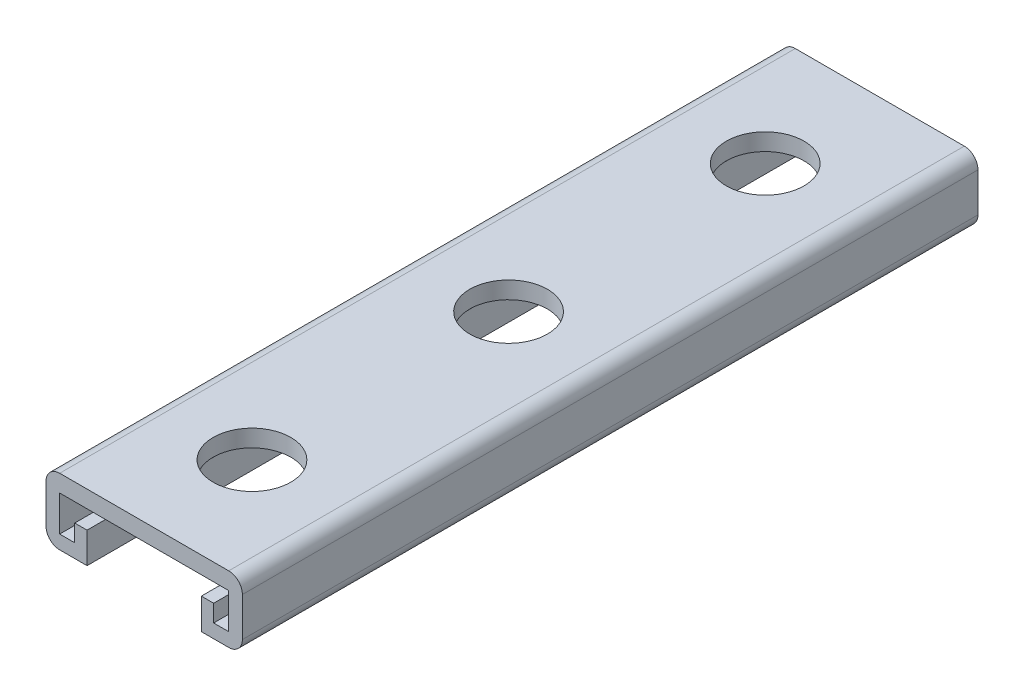
ISO-10303-21;
HEADER;
FILE_DESCRIPTION(('STEP AP214'),'2;1');
FILE_NAME('part.step','',(''),(''),'','','');
FILE_SCHEMA(('AUTOMOTIVE_DESIGN { 1 0 10303 214 1 1 1 1 }'));
ENDSEC;
DATA;
#1=APPLICATION_CONTEXT('core data for automotive mechanical design processes');
#2=APPLICATION_PROTOCOL_DEFINITION('international standard','automotive_design',2000,#1);
#3=PRODUCT_CONTEXT('',#1,'mechanical');
#4=PRODUCT('Part','Part','',(#3));
#5=PRODUCT_RELATED_PRODUCT_CATEGORY('part','',(#4));
#6=PRODUCT_DEFINITION_FORMATION('','',#4);
#7=PRODUCT_DEFINITION_CONTEXT('part definition',#1,'design');
#8=PRODUCT_DEFINITION('design','',#6,#7);
#9=PRODUCT_DEFINITION_SHAPE('','',#8);
#10=(LENGTH_UNIT() NAMED_UNIT(*) SI_UNIT(.MILLI.,.METRE.));
#11=(NAMED_UNIT(*) PLANE_ANGLE_UNIT() SI_UNIT($,.RADIAN.));
#12=(NAMED_UNIT(*) SI_UNIT($,.STERADIAN.) SOLID_ANGLE_UNIT());
#13=UNCERTAINTY_MEASURE_WITH_UNIT(LENGTH_MEASURE(1.E-05),#10,'distance_accuracy_value','');
#14=(GEOMETRIC_REPRESENTATION_CONTEXT(3) GLOBAL_UNCERTAINTY_ASSIGNED_CONTEXT((#13)) GLOBAL_UNIT_ASSIGNED_CONTEXT((#10,
#11,#12)) REPRESENTATION_CONTEXT('',''));
#15=CARTESIAN_POINT('',(0.,0.,0.));
#16=DIRECTION('',(0.,0.,1.));
#17=DIRECTION('',(1.,0.,0.));
#18=AXIS2_PLACEMENT_3D('',#15,#16,#17);
#19=CARTESIAN_POINT('',(0.,0.2,213.));
#20=DIRECTION('',(0.,1.,0.));
#21=DIRECTION('',(0.,0.,1.));
#22=AXIS2_PLACEMENT_3D('',#19,#20,#21);
#23=PLANE('',#22);
#24=CARTESIAN_POINT('',(0.,0.199999999999999,31.5));
#25=DIRECTION('',(0.,1.,0.));
#26=DIRECTION('',(0.,0.,1.));
#27=AXIS2_PLACEMENT_3D('',#24,#25,#26);
#28=CIRCLE('',#27,11.35);
#29=CARTESIAN_POINT('',(0.,0.199999999999999,42.85));
#30=VERTEX_POINT('',#29);
#31=EDGE_CURVE('E195',#30,#30,#28,.T.);
#32=ORIENTED_EDGE('',*,*,#31,.T.);
#33=EDGE_LOOP('',(#32));
#34=FACE_BOUND('',#33,.T.);
#35=CARTESIAN_POINT('',(0.,0.199999999999999,106.5));
#36=DIRECTION('',(0.,1.,0.));
#37=DIRECTION('',(0.,0.,1.));
#38=AXIS2_PLACEMENT_3D('',#35,#36,#37);
#39=CIRCLE('',#38,11.35);
#40=CARTESIAN_POINT('',(0.,0.199999999999999,117.85));
#41=VERTEX_POINT('',#40);
#42=EDGE_CURVE('E525',#41,#41,#39,.T.);
#43=ORIENTED_EDGE('',*,*,#42,.T.);
#44=EDGE_LOOP('',(#43));
#45=FACE_BOUND('',#44,.T.);
#46=CARTESIAN_POINT('',(0.,0.199999999999999,181.5));
#47=DIRECTION('',(0.,1.,0.));
#48=DIRECTION('',(0.,0.,1.));
#49=AXIS2_PLACEMENT_3D('',#46,#47,#48);
#50=CIRCLE('',#49,11.35);
#51=CARTESIAN_POINT('',(0.,0.199999999999999,192.85));
#52=VERTEX_POINT('',#51);
#53=EDGE_CURVE('E528',#52,#52,#50,.T.);
#54=ORIENTED_EDGE('',*,*,#53,.T.);
#55=EDGE_LOOP('',(#54));
#56=FACE_BOUND('',#55,.T.);
#57=DIRECTION('',(1.,0.,0.));
#58=VECTOR('',#57,1.);
#59=CARTESIAN_POINT('',(0.,0.2,0.));
#60=LINE('',#59,#58);
#61=CARTESIAN_POINT('',(-24.7,0.2,0.));
#62=VERTEX_POINT('',#61);
#63=CARTESIAN_POINT('',(24.7,0.2,0.));
#64=VERTEX_POINT('',#63);
#65=EDGE_CURVE('E312',#62,#64,#60,.T.);
#66=ORIENTED_EDGE('',*,*,#65,.T.);
#67=DIRECTION('',(0.,0.,-1.));
#68=VECTOR('',#67,1.);
#69=CARTESIAN_POINT('',(24.7,0.2,213.));
#70=LINE('',#69,#68);
#71=CARTESIAN_POINT('',(24.7,0.2,213.));
#72=VERTEX_POINT('',#71);
#73=EDGE_CURVE('E235',#72,#64,#70,.T.);
#74=ORIENTED_EDGE('',*,*,#73,.F.);
#75=DIRECTION('',(1.,0.,0.));
#76=VECTOR('',#75,1.);
#77=CARTESIAN_POINT('',(0.,0.2,213.));
#78=LINE('',#77,#76);
#79=CARTESIAN_POINT('',(-24.7,0.2,213.));
#80=VERTEX_POINT('',#79);
#81=EDGE_CURVE('E314',#80,#72,#78,.T.);
#82=ORIENTED_EDGE('',*,*,#81,.F.);
#83=DIRECTION('',(0.,0.,-1.));
#84=VECTOR('',#83,1.);
#85=CARTESIAN_POINT('',(-24.7,0.2,213.));
#86=LINE('',#85,#84);
#87=EDGE_CURVE('E368',#80,#62,#86,.T.);
#88=ORIENTED_EDGE('',*,*,#87,.T.);
#89=EDGE_LOOP('',(#66,#74,#82,#88));
#90=FACE_BOUND('',#89,.T.);
#91=ADVANCED_FACE('F45',(#34,#45,#56,#90),#23,.F.);
#92=CARTESIAN_POINT('',(24.7,0.,213.));
#93=DIRECTION('',(1.,0.,0.));
#94=DIRECTION('',(0.,0.,-1.));
#95=AXIS2_PLACEMENT_3D('',#92,#93,#94);
#96=PLANE('',#95);
#97=DIRECTION('',(0.,-1.,0.));
#98=VECTOR('',#97,1.);
#99=CARTESIAN_POINT('',(24.7,0.,0.));
#100=LINE('',#99,#98);
#101=CARTESIAN_POINT('',(24.7,-10.2,0.));
#102=VERTEX_POINT('',#101);
#103=EDGE_CURVE('E372',#64,#102,#100,.T.);
#104=ORIENTED_EDGE('',*,*,#103,.T.);
#105=DIRECTION('',(0.,0.,-1.));
#106=VECTOR('',#105,1.);
#107=CARTESIAN_POINT('',(24.7,-10.2,213.));
#108=LINE('',#107,#106);
#109=CARTESIAN_POINT('',(24.7,-10.2,213.));
#110=VERTEX_POINT('',#109);
#111=EDGE_CURVE('E231',#110,#102,#108,.T.);
#112=ORIENTED_EDGE('',*,*,#111,.F.);
#113=DIRECTION('',(0.,-1.,0.));
#114=VECTOR('',#113,1.);
#115=CARTESIAN_POINT('',(24.7,0.,213.));
#116=LINE('',#115,#114);
#117=EDGE_CURVE('E318',#72,#110,#116,.T.);
#118=ORIENTED_EDGE('',*,*,#117,.F.);
#119=ORIENTED_EDGE('',*,*,#73,.T.);
#120=EDGE_LOOP('',(#104,#112,#118,#119));
#121=FACE_BOUND('',#120,.T.);
#122=ADVANCED_FACE('F450',(#121),#96,.F.);
#123=CARTESIAN_POINT('',(0.,-10.2,213.));
#124=DIRECTION('',(0.,-1.,0.));
#125=DIRECTION('',(0.,0.,-1.));
#126=AXIS2_PLACEMENT_3D('',#123,#124,#125);
#127=PLANE('',#126);
#128=DIRECTION('',(-1.,0.,0.));
#129=VECTOR('',#128,1.);
#130=CARTESIAN_POINT('',(0.,-10.2,0.));
#131=LINE('',#130,#129);
#132=CARTESIAN_POINT('',(20.3,-10.2,0.));
#133=VERTEX_POINT('',#132);
#134=EDGE_CURVE('E376',#102,#133,#131,.T.);
#135=ORIENTED_EDGE('',*,*,#134,.T.);
#136=DIRECTION('',(0.,0.,-1.));
#137=VECTOR('',#136,1.);
#138=CARTESIAN_POINT('',(20.3,-10.2,213.));
#139=LINE('',#138,#137);
#140=CARTESIAN_POINT('',(20.3,-10.2,213.));
#141=VERTEX_POINT('',#140);
#142=EDGE_CURVE('E227',#141,#133,#139,.T.);
#143=ORIENTED_EDGE('',*,*,#142,.F.);
#144=DIRECTION('',(-1.,0.,0.));
#145=VECTOR('',#144,1.);
#146=CARTESIAN_POINT('',(0.,-10.2,213.));
#147=LINE('',#146,#145);
#148=EDGE_CURVE('E322',#110,#141,#147,.T.);
#149=ORIENTED_EDGE('',*,*,#148,.F.);
#150=ORIENTED_EDGE('',*,*,#111,.T.);
#151=EDGE_LOOP('',(#135,#143,#149,#150));
#152=FACE_BOUND('',#151,.T.);
#153=ADVANCED_FACE('F456',(#152),#127,.F.);
#154=CARTESIAN_POINT('',(20.3,0.,213.));
#155=DIRECTION('',(-1.,0.,0.));
#156=DIRECTION('',(0.,0.,1.));
#157=AXIS2_PLACEMENT_3D('',#154,#155,#156);
#158=PLANE('',#157);
#159=DIRECTION('',(0.,1.,0.));
#160=VECTOR('',#159,1.);
#161=CARTESIAN_POINT('',(20.3,0.,0.));
#162=LINE('',#161,#160);
#163=CARTESIAN_POINT('',(20.3,-5.2,0.));
#164=VERTEX_POINT('',#163);
#165=EDGE_CURVE('E380',#133,#164,#162,.T.);
#166=ORIENTED_EDGE('',*,*,#165,.T.);
#167=DIRECTION('',(0.,0.,-1.));
#168=VECTOR('',#167,1.);
#169=CARTESIAN_POINT('',(20.3,-5.2,213.));
#170=LINE('',#169,#168);
#171=CARTESIAN_POINT('',(20.3,-5.2,213.));
#172=VERTEX_POINT('',#171);
#173=EDGE_CURVE('E218',#172,#164,#170,.T.);
#174=ORIENTED_EDGE('',*,*,#173,.F.);
#175=DIRECTION('',(0.,1.,0.));
#176=VECTOR('',#175,1.);
#177=CARTESIAN_POINT('',(20.3,0.,213.));
#178=LINE('',#177,#176);
#179=EDGE_CURVE('E325',#141,#172,#178,.T.);
#180=ORIENTED_EDGE('',*,*,#179,.F.);
#181=ORIENTED_EDGE('',*,*,#142,.T.);
#182=EDGE_LOOP('',(#166,#174,#180,#181));
#183=FACE_BOUND('',#182,.T.);
#184=ADVANCED_FACE('F464',(#183),#158,.F.);
#185=CARTESIAN_POINT('',(0.,-5.2,213.));
#186=DIRECTION('',(0.,-1.,0.));
#187=DIRECTION('',(0.,0.,-1.));
#188=AXIS2_PLACEMENT_3D('',#185,#186,#187);
#189=PLANE('',#188);
#190=DIRECTION('',(-1.,0.,0.));
#191=VECTOR('',#190,1.);
#192=CARTESIAN_POINT('',(0.,-5.2,0.));
#193=LINE('',#192,#191);
#194=CARTESIAN_POINT('',(16.7,-5.2,0.));
#195=VERTEX_POINT('',#194);
#196=EDGE_CURVE('E207',#164,#195,#193,.T.);
#197=ORIENTED_EDGE('',*,*,#196,.T.);
#198=DIRECTION('',(0.,0.,-1.));
#199=VECTOR('',#198,1.);
#200=CARTESIAN_POINT('',(16.7,-5.2,213.));
#201=LINE('',#200,#199);
#202=CARTESIAN_POINT('',(16.7,-5.2,213.));
#203=VERTEX_POINT('',#202);
#204=EDGE_CURVE('E205',#203,#195,#201,.T.);
#205=ORIENTED_EDGE('',*,*,#204,.F.);
#206=DIRECTION('',(-1.,0.,0.));
#207=VECTOR('',#206,1.);
#208=CARTESIAN_POINT('',(0.,-5.2,213.));
#209=LINE('',#208,#207);
#210=EDGE_CURVE('E328',#172,#203,#209,.T.);
#211=ORIENTED_EDGE('',*,*,#210,.F.);
#212=ORIENTED_EDGE('',*,*,#173,.T.);
#213=EDGE_LOOP('',(#197,#205,#211,#212));
#214=FACE_BOUND('',#213,.T.);
#215=ADVANCED_FACE('F468',(#214),#189,.F.);
#216=CARTESIAN_POINT('',(16.7,0.,213.));
#217=DIRECTION('',(1.,0.,0.));
#218=DIRECTION('',(0.,0.,-1.));
#219=AXIS2_PLACEMENT_3D('',#216,#217,#218);
#220=PLANE('',#219);
#221=DIRECTION('',(0.,-1.,0.));
#222=VECTOR('',#221,1.);
#223=CARTESIAN_POINT('',(16.7,0.,0.));
#224=LINE('',#223,#222);
#225=CARTESIAN_POINT('',(16.7,-14.2,0.));
#226=VERTEX_POINT('',#225);
#227=EDGE_CURVE('E186',#195,#226,#224,.T.);
#228=ORIENTED_EDGE('',*,*,#227,.T.);
#229=DIRECTION('',(0.,0.,-1.));
#230=VECTOR('',#229,1.);
#231=CARTESIAN_POINT('',(16.7,-14.2,213.));
#232=LINE('',#231,#230);
#233=CARTESIAN_POINT('',(16.7,-14.2,213.));
#234=VERTEX_POINT('',#233);
#235=EDGE_CURVE('E202',#234,#226,#232,.T.);
#236=ORIENTED_EDGE('',*,*,#235,.F.);
#237=DIRECTION('',(0.,-1.,0.));
#238=VECTOR('',#237,1.);
#239=CARTESIAN_POINT('',(16.7,0.,213.));
#240=LINE('',#239,#238);
#241=EDGE_CURVE('E331',#203,#234,#240,.T.);
#242=ORIENTED_EDGE('',*,*,#241,.F.);
#243=ORIENTED_EDGE('',*,*,#204,.T.);
#244=EDGE_LOOP('',(#228,#236,#242,#243));
#245=FACE_BOUND('',#244,.T.);
#246=ADVANCED_FACE('F200',(#245),#220,.F.);
#247=CARTESIAN_POINT('',(28.7,0.,213.));
#248=DIRECTION('',(-1.,0.,0.));
#249=DIRECTION('',(0.,0.,1.));
#250=AXIS2_PLACEMENT_3D('',#247,#248,#249);
#251=PLANE('',#250);
#252=DIRECTION('',(0.,1.,0.));
#253=VECTOR('',#252,1.);
#254=CARTESIAN_POINT('',(28.7,0.,213.));
#255=LINE('',#254,#253);
#256=CARTESIAN_POINT('',(28.7,-10.2,213.));
#257=VERTEX_POINT('',#256);
#258=CARTESIAN_POINT('',(28.7,1.2,213.));
#259=VERTEX_POINT('',#258);
#260=EDGE_CURVE('E290',#257,#259,#255,.T.);
#261=ORIENTED_EDGE('',*,*,#260,.F.);
#262=DIRECTION('',(0.,0.,-1.));
#263=VECTOR('',#262,1.);
#264=CARTESIAN_POINT('',(28.7,-10.2,-2.));
#265=LINE('',#264,#263);
#266=CARTESIAN_POINT('',(28.7,-10.2,-2.));
#267=VERTEX_POINT('',#266);
#268=EDGE_CURVE('E279',#257,#267,#265,.T.);
#269=ORIENTED_EDGE('',*,*,#268,.T.);
#270=DIRECTION('',(0.,-1.,0.));
#271=VECTOR('',#270,1.);
#272=CARTESIAN_POINT('',(28.7,5.2,-2.));
#273=LINE('',#272,#271);
#274=CARTESIAN_POINT('',(28.7,1.2,-2.));
#275=VERTEX_POINT('',#274);
#276=EDGE_CURVE('E194',#275,#267,#273,.T.);
#277=ORIENTED_EDGE('',*,*,#276,.F.);
#278=DIRECTION('',(0.,0.,-1.));
#279=VECTOR('',#278,1.);
#280=CARTESIAN_POINT('',(28.7,1.2,213.));
#281=LINE('',#280,#279);
#282=EDGE_CURVE('E276',#275,#259,#281,.F.);
#283=ORIENTED_EDGE('',*,*,#282,.T.);
#284=EDGE_LOOP('',(#261,#269,#277,#283));
#285=FACE_BOUND('',#284,.T.);
#286=ADVANCED_FACE('F288',(#285),#251,.F.);
#287=CARTESIAN_POINT('',(0.,5.2,213.));
#288=DIRECTION('',(0.,1.,0.));
#289=DIRECTION('',(-1.,0.,0.));
#290=AXIS2_PLACEMENT_3D('',#287,#288,#289);
#291=PLANE('',#290);
#292=CARTESIAN_POINT('',(0.,5.2,31.5));
#293=DIRECTION('',(0.,1.,0.));
#294=DIRECTION('',(-1.,0.,0.));
#295=AXIS2_PLACEMENT_3D('',#292,#293,#294);
#296=CIRCLE('',#295,11.35);
#297=CARTESIAN_POINT('',(-11.35,5.2,31.5));
#298=VERTEX_POINT('',#297);
#299=EDGE_CURVE('E522',#298,#298,#296,.T.);
#300=ORIENTED_EDGE('',*,*,#299,.F.);
#301=EDGE_LOOP('',(#300));
#302=FACE_BOUND('',#301,.T.);
#303=CARTESIAN_POINT('',(0.,5.2,106.5));
#304=DIRECTION('',(0.,1.,0.));
#305=DIRECTION('',(-1.,0.,0.));
#306=AXIS2_PLACEMENT_3D('',#303,#304,#305);
#307=CIRCLE('',#306,11.35);
#308=CARTESIAN_POINT('',(-11.35,5.2,106.5));
#309=VERTEX_POINT('',#308);
#310=EDGE_CURVE('E538',#309,#309,#307,.T.);
#311=ORIENTED_EDGE('',*,*,#310,.F.);
#312=EDGE_LOOP('',(#311));
#313=FACE_BOUND('',#312,.T.);
#314=CARTESIAN_POINT('',(0.,5.2,181.5));
#315=DIRECTION('',(0.,1.,0.));
#316=DIRECTION('',(-1.,0.,0.));
#317=AXIS2_PLACEMENT_3D('',#314,#315,#316);
#318=CIRCLE('',#317,11.35);
#319=CARTESIAN_POINT('',(-11.35,5.2,181.5));
#320=VERTEX_POINT('',#319);
#321=EDGE_CURVE('E534',#320,#320,#318,.T.);
#322=ORIENTED_EDGE('',*,*,#321,.F.);
#323=EDGE_LOOP('',(#322));
#324=FACE_BOUND('',#323,.T.);
#325=DIRECTION('',(1.,0.,0.));
#326=VECTOR('',#325,1.);
#327=CARTESIAN_POINT('',(0.,5.2,213.));
#328=LINE('',#327,#326);
#329=CARTESIAN_POINT('',(-24.7,5.2,213.));
#330=VERTEX_POINT('',#329);
#331=CARTESIAN_POINT('',(24.7,5.2,213.));
#332=VERTEX_POINT('',#331);
#333=EDGE_CURVE('E338',#330,#332,#328,.T.);
#334=ORIENTED_EDGE('',*,*,#333,.T.);
#335=DIRECTION('',(0.,0.,-1.));
#336=VECTOR('',#335,1.);
#337=CARTESIAN_POINT('',(24.7,5.2,-2.));
#338=LINE('',#337,#336);
#339=CARTESIAN_POINT('',(24.7,5.2,-2.));
#340=VERTEX_POINT('',#339);
#341=EDGE_CURVE('E11',#332,#340,#338,.T.);
#342=ORIENTED_EDGE('',*,*,#341,.T.);
#343=DIRECTION('',(1.,0.,0.));
#344=VECTOR('',#343,1.);
#345=CARTESIAN_POINT('',(28.7,5.2,-2.));
#346=LINE('',#345,#344);
#347=CARTESIAN_POINT('',(-24.7,5.2,-2.));
#348=VERTEX_POINT('',#347);
#349=EDGE_CURVE('E310',#348,#340,#346,.T.);
#350=ORIENTED_EDGE('',*,*,#349,.F.);
#351=DIRECTION('',(0.,0.,-1.));
#352=VECTOR('',#351,1.);
#353=CARTESIAN_POINT('',(-24.7,5.2,213.));
#354=LINE('',#353,#352);
#355=EDGE_CURVE('E54',#348,#330,#354,.F.);
#356=ORIENTED_EDGE('',*,*,#355,.T.);
#357=EDGE_LOOP('',(#334,#342,#350,#356));
#358=FACE_BOUND('',#357,.T.);
#359=ADVANCED_FACE('F437',(#302,#313,#324,#358),#291,.T.);
#360=CARTESIAN_POINT('',(-28.7,0.,213.));
#361=DIRECTION('',(-1.,0.,0.));
#362=DIRECTION('',(0.,0.,1.));
#363=AXIS2_PLACEMENT_3D('',#360,#361,#362);
#364=PLANE('',#363);
#365=DIRECTION('',(0.,1.,0.));
#366=VECTOR('',#365,1.);
#367=CARTESIAN_POINT('',(-28.7,5.2,-2.));
#368=LINE('',#367,#366);
#369=CARTESIAN_POINT('',(-28.7,-10.2,-2.));
#370=VERTEX_POINT('',#369);
#371=CARTESIAN_POINT('',(-28.7,1.2,-2.));
#372=VERTEX_POINT('',#371);
#373=EDGE_CURVE('E302',#370,#372,#368,.T.);
#374=ORIENTED_EDGE('',*,*,#373,.F.);
#375=DIRECTION('',(0.,0.,-1.));
#376=VECTOR('',#375,1.);
#377=CARTESIAN_POINT('',(-28.7,-10.2,213.));
#378=LINE('',#377,#376);
#379=CARTESIAN_POINT('',(-28.7,-10.2,213.));
#380=VERTEX_POINT('',#379);
#381=EDGE_CURVE('E262',#370,#380,#378,.F.);
#382=ORIENTED_EDGE('',*,*,#381,.T.);
#383=DIRECTION('',(0.,1.,0.));
#384=VECTOR('',#383,1.);
#385=CARTESIAN_POINT('',(-28.7,0.,213.));
#386=LINE('',#385,#384);
#387=CARTESIAN_POINT('',(-28.7,1.2,213.));
#388=VERTEX_POINT('',#387);
#389=EDGE_CURVE('E341',#380,#388,#386,.T.);
#390=ORIENTED_EDGE('',*,*,#389,.T.);
#391=DIRECTION('',(0.,0.,-1.));
#392=VECTOR('',#391,1.);
#393=CARTESIAN_POINT('',(-28.7,1.2,213.));
#394=LINE('',#393,#392);
#395=EDGE_CURVE('E258',#388,#372,#394,.T.);
#396=ORIENTED_EDGE('',*,*,#395,.T.);
#397=EDGE_LOOP('',(#374,#382,#390,#396));
#398=FACE_BOUND('',#397,.T.);
#399=ADVANCED_FACE('F433',(#398),#364,.T.);
#400=CARTESIAN_POINT('',(0.,-14.2,213.));
#401=DIRECTION('',(0.,-1.,0.));
#402=DIRECTION('',(1.,0.,0.));
#403=AXIS2_PLACEMENT_3D('',#400,#401,#402);
#404=PLANE('',#403);
#405=DIRECTION('',(-1.,0.,0.));
#406=VECTOR('',#405,1.);
#407=CARTESIAN_POINT('',(0.,-14.2,213.));
#408=LINE('',#407,#406);
#409=CARTESIAN_POINT('',(-16.7,-14.2,213.));
#410=VERTEX_POINT('',#409);
#411=CARTESIAN_POINT('',(-24.7,-14.2,213.));
#412=VERTEX_POINT('',#411);
#413=EDGE_CURVE('E345',#410,#412,#408,.T.);
#414=ORIENTED_EDGE('',*,*,#413,.T.);
#415=DIRECTION('',(0.,0.,-1.));
#416=VECTOR('',#415,1.);
#417=CARTESIAN_POINT('',(-24.7,-14.2,213.));
#418=LINE('',#417,#416);
#419=CARTESIAN_POINT('',(-24.7,-14.2,-2.));
#420=VERTEX_POINT('',#419);
#421=EDGE_CURVE('E242',#412,#420,#418,.T.);
#422=ORIENTED_EDGE('',*,*,#421,.T.);
#423=DIRECTION('',(-1.,0.,0.));
#424=VECTOR('',#423,1.);
#425=CARTESIAN_POINT('',(28.7,-14.2,-2.));
#426=LINE('',#425,#424);
#427=CARTESIAN_POINT('',(24.7,-14.2,-2.));
#428=VERTEX_POINT('',#427);
#429=EDGE_CURVE('E299',#428,#420,#426,.T.);
#430=ORIENTED_EDGE('',*,*,#429,.F.);
#431=DIRECTION('',(0.,0.,-1.));
#432=VECTOR('',#431,1.);
#433=CARTESIAN_POINT('',(24.7,-14.2,213.));
#434=LINE('',#433,#432);
#435=CARTESIAN_POINT('',(24.7,-14.2,213.));
#436=VERTEX_POINT('',#435);
#437=EDGE_CURVE('E239',#428,#436,#434,.F.);
#438=ORIENTED_EDGE('',*,*,#437,.T.);
#439=DIRECTION('',(1.,0.,0.));
#440=VECTOR('',#439,1.);
#441=CARTESIAN_POINT('',(0.,-14.2,213.));
#442=LINE('',#441,#440);
#443=EDGE_CURVE('E212',#234,#436,#442,.T.);
#444=ORIENTED_EDGE('',*,*,#443,.F.);
#445=ORIENTED_EDGE('',*,*,#235,.T.);
#446=DIRECTION('',(-1.,0.,0.));
#447=VECTOR('',#446,1.);
#448=CARTESIAN_POINT('',(28.7,-14.2,0.));
#449=LINE('',#448,#447);
#450=CARTESIAN_POINT('',(-16.7,-14.2,0.));
#451=VERTEX_POINT('',#450);
#452=EDGE_CURVE('E183',#226,#451,#449,.T.);
#453=ORIENTED_EDGE('',*,*,#452,.T.);
#454=DIRECTION('',(0.,0.,-1.));
#455=VECTOR('',#454,1.);
#456=CARTESIAN_POINT('',(-16.7,-14.2,213.));
#457=LINE('',#456,#455);
#458=EDGE_CURVE('E214',#410,#451,#457,.T.);
#459=ORIENTED_EDGE('',*,*,#458,.F.);
#460=EDGE_LOOP('',(#414,#422,#430,#438,#444,#445,#453,#459));
#461=FACE_BOUND('',#460,.T.);
#462=ADVANCED_FACE('F210',(#461),#404,.T.);
#463=CARTESIAN_POINT('',(-16.7,0.,213.));
#464=DIRECTION('',(1.,0.,0.));
#465=DIRECTION('',(0.,0.,-1.));
#466=AXIS2_PLACEMENT_3D('',#463,#464,#465);
#467=PLANE('',#466);
#468=DIRECTION('',(0.,-1.,0.));
#469=VECTOR('',#468,1.);
#470=CARTESIAN_POINT('',(-16.7,0.,0.));
#471=LINE('',#470,#469);
#472=CARTESIAN_POINT('',(-16.7,-5.2,0.));
#473=VERTEX_POINT('',#472);
#474=EDGE_CURVE('E189',#473,#451,#471,.T.);
#475=ORIENTED_EDGE('',*,*,#474,.F.);
#476=DIRECTION('',(0.,0.,-1.));
#477=VECTOR('',#476,1.);
#478=CARTESIAN_POINT('',(-16.7,-5.2,213.));
#479=LINE('',#478,#477);
#480=CARTESIAN_POINT('',(-16.7,-5.2,213.));
#481=VERTEX_POINT('',#480);
#482=EDGE_CURVE('E220',#481,#473,#479,.T.);
#483=ORIENTED_EDGE('',*,*,#482,.F.);
#484=DIRECTION('',(0.,-1.,0.));
#485=VECTOR('',#484,1.);
#486=CARTESIAN_POINT('',(-16.7,0.,213.));
#487=LINE('',#486,#485);
#488=EDGE_CURVE('E348',#481,#410,#487,.T.);
#489=ORIENTED_EDGE('',*,*,#488,.T.);
#490=ORIENTED_EDGE('',*,*,#458,.T.);
#491=EDGE_LOOP('',(#475,#483,#489,#490));
#492=FACE_BOUND('',#491,.T.);
#493=ADVANCED_FACE('F421',(#492),#467,.T.);
#494=CARTESIAN_POINT('',(0.,-5.2,213.));
#495=DIRECTION('',(0.,1.,0.));
#496=DIRECTION('',(0.,0.,1.));
#497=AXIS2_PLACEMENT_3D('',#494,#495,#496);
#498=PLANE('',#497);
#499=DIRECTION('',(1.,0.,0.));
#500=VECTOR('',#499,1.);
#501=CARTESIAN_POINT('',(0.,-5.2,0.));
#502=LINE('',#501,#500);
#503=CARTESIAN_POINT('',(-20.3,-5.2,0.));
#504=VERTEX_POINT('',#503);
#505=EDGE_CURVE('E388',#504,#473,#502,.T.);
#506=ORIENTED_EDGE('',*,*,#505,.F.);
#507=DIRECTION('',(0.,0.,-1.));
#508=VECTOR('',#507,1.);
#509=CARTESIAN_POINT('',(-20.3,-5.2,213.));
#510=LINE('',#509,#508);
#511=CARTESIAN_POINT('',(-20.3,-5.2,213.));
#512=VERTEX_POINT('',#511);
#513=EDGE_CURVE('E410',#512,#504,#510,.T.);
#514=ORIENTED_EDGE('',*,*,#513,.F.);
#515=DIRECTION('',(1.,0.,0.));
#516=VECTOR('',#515,1.);
#517=CARTESIAN_POINT('',(0.,-5.2,213.));
#518=LINE('',#517,#516);
#519=EDGE_CURVE('E352',#512,#481,#518,.T.);
#520=ORIENTED_EDGE('',*,*,#519,.T.);
#521=ORIENTED_EDGE('',*,*,#482,.T.);
#522=EDGE_LOOP('',(#506,#514,#520,#521));
#523=FACE_BOUND('',#522,.T.);
#524=ADVANCED_FACE('F417',(#523),#498,.T.);
#525=CARTESIAN_POINT('',(-20.3,0.,213.));
#526=DIRECTION('',(-1.,0.,0.));
#527=DIRECTION('',(0.,0.,1.));
#528=AXIS2_PLACEMENT_3D('',#525,#526,#527);
#529=PLANE('',#528);
#530=DIRECTION('',(0.,1.,0.));
#531=VECTOR('',#530,1.);
#532=CARTESIAN_POINT('',(-20.3,0.,0.));
#533=LINE('',#532,#531);
#534=CARTESIAN_POINT('',(-20.3,-10.2,0.));
#535=VERTEX_POINT('',#534);
#536=EDGE_CURVE('E391',#535,#504,#533,.T.);
#537=ORIENTED_EDGE('',*,*,#536,.F.);
#538=DIRECTION('',(0.,0.,-1.));
#539=VECTOR('',#538,1.);
#540=CARTESIAN_POINT('',(-20.3,-10.2,213.));
#541=LINE('',#540,#539);
#542=CARTESIAN_POINT('',(-20.3,-10.2,213.));
#543=VERTEX_POINT('',#542);
#544=EDGE_CURVE('E406',#543,#535,#541,.T.);
#545=ORIENTED_EDGE('',*,*,#544,.F.);
#546=DIRECTION('',(0.,1.,0.));
#547=VECTOR('',#546,1.);
#548=CARTESIAN_POINT('',(-20.3,0.,213.));
#549=LINE('',#548,#547);
#550=EDGE_CURVE('E356',#543,#512,#549,.T.);
#551=ORIENTED_EDGE('',*,*,#550,.T.);
#552=ORIENTED_EDGE('',*,*,#513,.T.);
#553=EDGE_LOOP('',(#537,#545,#551,#552));
#554=FACE_BOUND('',#553,.T.);
#555=ADVANCED_FACE('F488',(#554),#529,.T.);
#556=CARTESIAN_POINT('',(0.,-10.2,213.));
#557=DIRECTION('',(0.,1.,0.));
#558=DIRECTION('',(0.,0.,1.));
#559=AXIS2_PLACEMENT_3D('',#556,#557,#558);
#560=PLANE('',#559);
#561=DIRECTION('',(1.,0.,0.));
#562=VECTOR('',#561,1.);
#563=CARTESIAN_POINT('',(0.,-10.2,0.));
#564=LINE('',#563,#562);
#565=CARTESIAN_POINT('',(-24.7,-10.2,0.));
#566=VERTEX_POINT('',#565);
#567=EDGE_CURVE('E394',#566,#535,#564,.T.);
#568=ORIENTED_EDGE('',*,*,#567,.F.);
#569=DIRECTION('',(0.,0.,-1.));
#570=VECTOR('',#569,1.);
#571=CARTESIAN_POINT('',(-24.7,-10.2,213.));
#572=LINE('',#571,#570);
#573=CARTESIAN_POINT('',(-24.7,-10.2,213.));
#574=VERTEX_POINT('',#573);
#575=EDGE_CURVE('E402',#574,#566,#572,.T.);
#576=ORIENTED_EDGE('',*,*,#575,.F.);
#577=DIRECTION('',(1.,0.,0.));
#578=VECTOR('',#577,1.);
#579=CARTESIAN_POINT('',(0.,-10.2,213.));
#580=LINE('',#579,#578);
#581=EDGE_CURVE('E360',#574,#543,#580,.T.);
#582=ORIENTED_EDGE('',*,*,#581,.T.);
#583=ORIENTED_EDGE('',*,*,#544,.T.);
#584=EDGE_LOOP('',(#568,#576,#582,#583));
#585=FACE_BOUND('',#584,.T.);
#586=ADVANCED_FACE('F491',(#585),#560,.T.);
#587=CARTESIAN_POINT('',(-24.7,0.,213.));
#588=DIRECTION('',(1.,0.,0.));
#589=DIRECTION('',(0.,0.,-1.));
#590=AXIS2_PLACEMENT_3D('',#587,#588,#589);
#591=PLANE('',#590);
#592=DIRECTION('',(0.,-1.,0.));
#593=VECTOR('',#592,1.);
#594=CARTESIAN_POINT('',(-24.7,0.,0.));
#595=LINE('',#594,#593);
#596=EDGE_CURVE('E319',#62,#566,#595,.T.);
#597=ORIENTED_EDGE('',*,*,#596,.F.);
#598=ORIENTED_EDGE('',*,*,#87,.F.);
#599=DIRECTION('',(0.,-1.,0.));
#600=VECTOR('',#599,1.);
#601=CARTESIAN_POINT('',(-24.7,0.,213.));
#602=LINE('',#601,#600);
#603=EDGE_CURVE('E364',#80,#574,#602,.T.);
#604=ORIENTED_EDGE('',*,*,#603,.T.);
#605=ORIENTED_EDGE('',*,*,#575,.T.);
#606=EDGE_LOOP('',(#597,#598,#604,#605));
#607=FACE_BOUND('',#606,.T.);
#608=ADVANCED_FACE('F495',(#607),#591,.T.);
#609=CARTESIAN_POINT('',(0.,0.,213.));
#610=DIRECTION('',(0.,0.,1.));
#611=DIRECTION('',(1.,0.,0.));
#612=AXIS2_PLACEMENT_3D('',#609,#610,#611);
#613=PLANE('',#612);
#614=ORIENTED_EDGE('',*,*,#389,.F.);
#615=CARTESIAN_POINT('',(-24.7,-10.2,213.));
#616=DIRECTION('',(0.,0.,1.));
#617=DIRECTION('',(1.,0.,0.));
#618=AXIS2_PLACEMENT_3D('',#615,#616,#617);
#619=CIRCLE('',#618,4.);
#620=EDGE_CURVE('E273',#380,#412,#619,.T.);
#621=ORIENTED_EDGE('',*,*,#620,.T.);
#622=ORIENTED_EDGE('',*,*,#413,.F.);
#623=ORIENTED_EDGE('',*,*,#488,.F.);
#624=ORIENTED_EDGE('',*,*,#519,.F.);
#625=ORIENTED_EDGE('',*,*,#550,.F.);
#626=ORIENTED_EDGE('',*,*,#581,.F.);
#627=ORIENTED_EDGE('',*,*,#603,.F.);
#628=ORIENTED_EDGE('',*,*,#81,.T.);
#629=ORIENTED_EDGE('',*,*,#117,.T.);
#630=ORIENTED_EDGE('',*,*,#148,.T.);
#631=ORIENTED_EDGE('',*,*,#179,.T.);
#632=ORIENTED_EDGE('',*,*,#210,.T.);
#633=ORIENTED_EDGE('',*,*,#241,.T.);
#634=ORIENTED_EDGE('',*,*,#443,.T.);
#635=CARTESIAN_POINT('',(24.7,-10.2,213.));
#636=DIRECTION('',(0.,0.,1.));
#637=DIRECTION('',(1.,0.,0.));
#638=AXIS2_PLACEMENT_3D('',#635,#636,#637);
#639=CIRCLE('',#638,4.);
#640=EDGE_CURVE('E270',#436,#257,#639,.T.);
#641=ORIENTED_EDGE('',*,*,#640,.T.);
#642=ORIENTED_EDGE('',*,*,#260,.T.);
#643=CARTESIAN_POINT('',(24.7,1.2,213.));
#644=DIRECTION('',(0.,0.,1.));
#645=DIRECTION('',(1.,0.,0.));
#646=AXIS2_PLACEMENT_3D('',#643,#644,#645);
#647=CIRCLE('',#646,4.);
#648=EDGE_CURVE('E61',#259,#332,#647,.T.);
#649=ORIENTED_EDGE('',*,*,#648,.T.);
#650=ORIENTED_EDGE('',*,*,#333,.F.);
#651=CARTESIAN_POINT('',(-24.7,1.2,213.));
#652=DIRECTION('',(0.,0.,1.));
#653=DIRECTION('',(1.,0.,0.));
#654=AXIS2_PLACEMENT_3D('',#651,#652,#653);
#655=CIRCLE('',#654,4.);
#656=EDGE_CURVE('E265',#330,#388,#655,.T.);
#657=ORIENTED_EDGE('',*,*,#656,.T.);
#658=EDGE_LOOP('',(#614,#621,#622,#623,#624,#625,#626,#627,#628,#629,#630,#631,#632,#633,#634,
#641,#642,#649,#650,#657));
#659=FACE_BOUND('',#658,.T.);
#660=ADVANCED_FACE('F425',(#659),#613,.T.);
#661=CARTESIAN_POINT('',(0.,0.,0.));
#662=DIRECTION('',(0.,0.,-1.));
#663=DIRECTION('',(-1.,0.,0.));
#664=AXIS2_PLACEMENT_3D('',#661,#662,#663);
#665=PLANE('',#664);
#666=ORIENTED_EDGE('',*,*,#505,.T.);
#667=ORIENTED_EDGE('',*,*,#474,.T.);
#668=ORIENTED_EDGE('',*,*,#452,.F.);
#669=ORIENTED_EDGE('',*,*,#227,.F.);
#670=ORIENTED_EDGE('',*,*,#196,.F.);
#671=ORIENTED_EDGE('',*,*,#165,.F.);
#672=ORIENTED_EDGE('',*,*,#134,.F.);
#673=ORIENTED_EDGE('',*,*,#103,.F.);
#674=ORIENTED_EDGE('',*,*,#65,.F.);
#675=ORIENTED_EDGE('',*,*,#596,.T.);
#676=ORIENTED_EDGE('',*,*,#567,.T.);
#677=ORIENTED_EDGE('',*,*,#536,.T.);
#678=EDGE_LOOP('',(#666,#667,#668,#669,#670,#671,#672,#673,#674,#675,#676,#677));
#679=FACE_BOUND('',#678,.T.);
#680=ADVANCED_FACE('F185',(#679),#665,.F.);
#681=CARTESIAN_POINT('',(0.,0.,-2.));
#682=DIRECTION('',(0.,0.,-1.));
#683=DIRECTION('',(-1.,0.,0.));
#684=AXIS2_PLACEMENT_3D('',#681,#682,#683);
#685=PLANE('',#684);
#686=ORIENTED_EDGE('',*,*,#429,.T.);
#687=CARTESIAN_POINT('',(-24.7,-10.2,-2.));
#688=DIRECTION('',(0.,0.,-1.));
#689=DIRECTION('',(-1.,0.,0.));
#690=AXIS2_PLACEMENT_3D('',#687,#688,#689);
#691=CIRCLE('',#690,4.);
#692=EDGE_CURVE('E255',#420,#370,#691,.T.);
#693=ORIENTED_EDGE('',*,*,#692,.T.);
#694=ORIENTED_EDGE('',*,*,#373,.T.);
#695=CARTESIAN_POINT('',(-24.7,1.2,-2.));
#696=DIRECTION('',(0.,0.,-1.));
#697=DIRECTION('',(-1.,0.,0.));
#698=AXIS2_PLACEMENT_3D('',#695,#696,#697);
#699=CIRCLE('',#698,4.);
#700=EDGE_CURVE('E246',#372,#348,#699,.T.);
#701=ORIENTED_EDGE('',*,*,#700,.T.);
#702=ORIENTED_EDGE('',*,*,#349,.T.);
#703=CARTESIAN_POINT('',(24.7,1.2,-2.));
#704=DIRECTION('',(0.,0.,-1.));
#705=DIRECTION('',(-1.,0.,0.));
#706=AXIS2_PLACEMENT_3D('',#703,#704,#705);
#707=CIRCLE('',#706,4.);
#708=EDGE_CURVE('E249',#340,#275,#707,.T.);
#709=ORIENTED_EDGE('',*,*,#708,.T.);
#710=ORIENTED_EDGE('',*,*,#276,.T.);
#711=CARTESIAN_POINT('',(24.7,-10.2,-2.));
#712=DIRECTION('',(0.,0.,-1.));
#713=DIRECTION('',(-1.,0.,0.));
#714=AXIS2_PLACEMENT_3D('',#711,#712,#713);
#715=CIRCLE('',#714,4.);
#716=EDGE_CURVE('E252',#267,#428,#715,.T.);
#717=ORIENTED_EDGE('',*,*,#716,.T.);
#718=EDGE_LOOP('',(#686,#693,#694,#701,#702,#709,#710,#717));
#719=FACE_BOUND('',#718,.T.);
#720=ADVANCED_FACE('F295',(#719),#685,.T.);
#721=CARTESIAN_POINT('',(-24.7,-10.2,213.));
#722=DIRECTION('',(0.,0.,-1.));
#723=DIRECTION('',(-1.,0.,0.));
#724=AXIS2_PLACEMENT_3D('',#721,#722,#723);
#725=CYLINDRICAL_SURFACE('',#724,4.);
#726=ORIENTED_EDGE('',*,*,#620,.F.);
#727=ORIENTED_EDGE('',*,*,#381,.F.);
#728=ORIENTED_EDGE('',*,*,#692,.F.);
#729=ORIENTED_EDGE('',*,*,#421,.F.);
#730=EDGE_LOOP('',(#726,#727,#728,#729));
#731=FACE_BOUND('',#730,.T.);
#732=ADVANCED_FACE('F429',(#731),#725,.T.);
#733=CARTESIAN_POINT('',(24.7,-10.2,213.));
#734=DIRECTION('',(0.,0.,1.));
#735=DIRECTION('',(1.,0.,0.));
#736=AXIS2_PLACEMENT_3D('',#733,#734,#735);
#737=CYLINDRICAL_SURFACE('',#736,4.);
#738=ORIENTED_EDGE('',*,*,#640,.F.);
#739=ORIENTED_EDGE('',*,*,#437,.F.);
#740=ORIENTED_EDGE('',*,*,#716,.F.);
#741=ORIENTED_EDGE('',*,*,#268,.F.);
#742=EDGE_LOOP('',(#738,#739,#740,#741));
#743=FACE_BOUND('',#742,.T.);
#744=ADVANCED_FACE('F441',(#743),#737,.T.);
#745=CARTESIAN_POINT('',(24.7,1.2,213.));
#746=DIRECTION('',(0.,0.,1.));
#747=DIRECTION('',(1.,0.,0.));
#748=AXIS2_PLACEMENT_3D('',#745,#746,#747);
#749=CYLINDRICAL_SURFACE('',#748,4.);
#750=ORIENTED_EDGE('',*,*,#648,.F.);
#751=ORIENTED_EDGE('',*,*,#282,.F.);
#752=ORIENTED_EDGE('',*,*,#708,.F.);
#753=ORIENTED_EDGE('',*,*,#341,.F.);
#754=EDGE_LOOP('',(#750,#751,#752,#753));
#755=FACE_BOUND('',#754,.T.);
#756=ADVANCED_FACE('F440',(#755),#749,.T.);
#757=CARTESIAN_POINT('',(-24.7,1.2,213.));
#758=DIRECTION('',(0.,0.,-1.));
#759=DIRECTION('',(-1.,0.,0.));
#760=AXIS2_PLACEMENT_3D('',#757,#758,#759);
#761=CYLINDRICAL_SURFACE('',#760,4.);
#762=ORIENTED_EDGE('',*,*,#656,.F.);
#763=ORIENTED_EDGE('',*,*,#355,.F.);
#764=ORIENTED_EDGE('',*,*,#700,.F.);
#765=ORIENTED_EDGE('',*,*,#395,.F.);
#766=EDGE_LOOP('',(#762,#763,#764,#765));
#767=FACE_BOUND('',#766,.T.);
#768=ADVANCED_FACE('F47',(#767),#761,.T.);
#769=CARTESIAN_POINT('',(0.,-53.8,181.5));
#770=DIRECTION('',(0.,1.,0.));
#771=DIRECTION('',(-1.,0.,0.));
#772=AXIS2_PLACEMENT_3D('',#769,#770,#771);
#773=CYLINDRICAL_SURFACE('',#772,11.35);
#774=ORIENTED_EDGE('',*,*,#321,.T.);
#775=EDGE_LOOP('',(#774));
#776=FACE_BOUND('',#775,.T.);
#777=ORIENTED_EDGE('',*,*,#53,.F.);
#778=EDGE_LOOP('',(#777));
#779=FACE_BOUND('',#778,.T.);
#780=ADVANCED_FACE('F506',(#776,#779),#773,.F.);
#781=CARTESIAN_POINT('',(0.,-53.8,106.5));
#782=DIRECTION('',(0.,1.,0.));
#783=DIRECTION('',(-1.,0.,0.));
#784=AXIS2_PLACEMENT_3D('',#781,#782,#783);
#785=CYLINDRICAL_SURFACE('',#784,11.35);
#786=ORIENTED_EDGE('',*,*,#310,.T.);
#787=EDGE_LOOP('',(#786));
#788=FACE_BOUND('',#787,.T.);
#789=ORIENTED_EDGE('',*,*,#42,.F.);
#790=EDGE_LOOP('',(#789));
#791=FACE_BOUND('',#790,.T.);
#792=ADVANCED_FACE('F509',(#788,#791),#785,.F.);
#793=CARTESIAN_POINT('',(0.,-53.8,31.5));
#794=DIRECTION('',(0.,1.,0.));
#795=DIRECTION('',(-1.,0.,0.));
#796=AXIS2_PLACEMENT_3D('',#793,#794,#795);
#797=CYLINDRICAL_SURFACE('',#796,11.35);
#798=ORIENTED_EDGE('',*,*,#299,.T.);
#799=EDGE_LOOP('',(#798));
#800=FACE_BOUND('',#799,.T.);
#801=ORIENTED_EDGE('',*,*,#31,.F.);
#802=EDGE_LOOP('',(#801));
#803=FACE_BOUND('',#802,.T.);
#804=ADVANCED_FACE('F513',(#800,#803),#797,.F.);
#805=CLOSED_SHELL('',(#91,#122,#153,#184,#215,#246,#286,#359,#399,#462,#493,#524,#555,#586,#608,
#660,#680,#720,#732,#744,#756,#768,#780,#792,#804));
#806=MANIFOLD_SOLID_BREP('B2',#805);
#807=ADVANCED_BREP_SHAPE_REPRESENTATION('',(#18,#806),#14);
#808=SHAPE_DEFINITION_REPRESENTATION(#9,#807);
ENDSEC;
END-ISO-10303-21;
